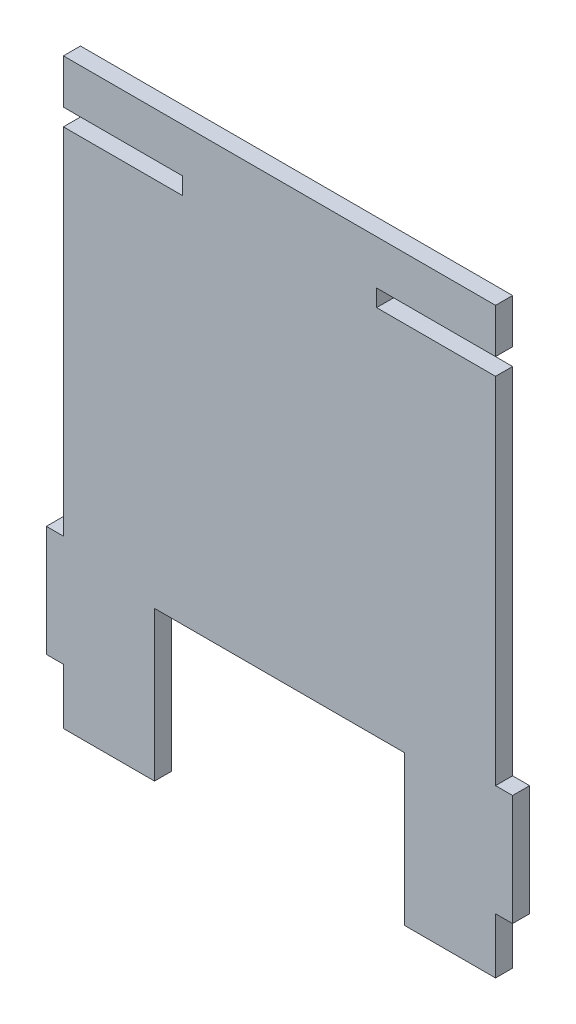
ISO-10303-21;
HEADER;
FILE_DESCRIPTION(('STEP AP214'),'2;1');
FILE_NAME('part.step','',(''),(''),'','','');
FILE_SCHEMA(('AUTOMOTIVE_DESIGN { 1 0 10303 214 1 1 1 1 }'));
ENDSEC;
DATA;
#1=APPLICATION_CONTEXT('core data for automotive mechanical design processes');
#2=APPLICATION_PROTOCOL_DEFINITION('international standard','automotive_design',2000,#1);
#3=PRODUCT_CONTEXT('',#1,'mechanical');
#4=PRODUCT('Part','Part','',(#3));
#5=PRODUCT_RELATED_PRODUCT_CATEGORY('part','',(#4));
#6=PRODUCT_DEFINITION_FORMATION('','',#4);
#7=PRODUCT_DEFINITION_CONTEXT('part definition',#1,'design');
#8=PRODUCT_DEFINITION('design','',#6,#7);
#9=PRODUCT_DEFINITION_SHAPE('','',#8);
#10=(LENGTH_UNIT() NAMED_UNIT(*) SI_UNIT(.MILLI.,.METRE.));
#11=(NAMED_UNIT(*) PLANE_ANGLE_UNIT() SI_UNIT($,.RADIAN.));
#12=(NAMED_UNIT(*) SI_UNIT($,.STERADIAN.) SOLID_ANGLE_UNIT());
#13=UNCERTAINTY_MEASURE_WITH_UNIT(LENGTH_MEASURE(1.E-05),#10,'distance_accuracy_value','');
#14=(GEOMETRIC_REPRESENTATION_CONTEXT(3) GLOBAL_UNCERTAINTY_ASSIGNED_CONTEXT((#13)) GLOBAL_UNIT_ASSIGNED_CONTEXT((#10,
#11,#12)) REPRESENTATION_CONTEXT('',''));
#15=CARTESIAN_POINT('',(0.,0.,0.));
#16=DIRECTION('',(0.,0.,1.));
#17=DIRECTION('',(1.,0.,0.));
#18=AXIS2_PLACEMENT_3D('',#15,#16,#17);
#19=CARTESIAN_POINT('',(-38.9099999999999,-383.79,19.98));
#20=DIRECTION('',(0.,1.,0.));
#21=DIRECTION('',(0.,0.,1.));
#22=AXIS2_PLACEMENT_3D('',#19,#20,#21);
#23=PLANE('',#22);
#24=DIRECTION('',(1.,0.,0.));
#25=VECTOR('',#24,1.);
#26=CARTESIAN_POINT('',(-38.9099999999999,-383.79,16.91));
#27=LINE('',#26,#25);
#28=CARTESIAN_POINT('',(-38.9099999999999,-383.79,16.91));
#29=VERTEX_POINT('',#28);
#30=CARTESIAN_POINT('',(-22.4999999999999,-383.79,16.91));
#31=VERTEX_POINT('',#30);
#32=EDGE_CURVE('E244',#29,#31,#27,.T.);
#33=ORIENTED_EDGE('',*,*,#32,.T.);
#34=DIRECTION('',(0.,0.,1.));
#35=VECTOR('',#34,1.);
#36=CARTESIAN_POINT('',(-22.4999999999999,-383.79,19.98));
#37=LINE('',#36,#35);
#38=CARTESIAN_POINT('',(-22.4999999999999,-383.79,19.98));
#39=VERTEX_POINT('',#38);
#40=EDGE_CURVE('E229',#31,#39,#37,.T.);
#41=ORIENTED_EDGE('',*,*,#40,.T.);
#42=DIRECTION('',(1.,0.,0.));
#43=VECTOR('',#42,1.);
#44=CARTESIAN_POINT('',(-38.9099999999999,-383.79,19.98));
#45=LINE('',#44,#43);
#46=CARTESIAN_POINT('',(-38.9099999999999,-383.79,19.98));
#47=VERTEX_POINT('',#46);
#48=EDGE_CURVE('E350',#47,#39,#45,.T.);
#49=ORIENTED_EDGE('',*,*,#48,.F.);
#50=DIRECTION('',(0.,0.,-1.));
#51=VECTOR('',#50,1.);
#52=CARTESIAN_POINT('',(-38.9099999999999,-383.79,19.98));
#53=LINE('',#52,#51);
#54=EDGE_CURVE('E295',#47,#29,#53,.T.);
#55=ORIENTED_EDGE('',*,*,#54,.T.);
#56=EDGE_LOOP('',(#33,#41,#49,#55));
#57=FACE_BOUND('',#56,.T.);
#58=ADVANCED_FACE('F43',(#57),#23,.F.);
#59=CARTESIAN_POINT('',(-17.49,-286.88,19.98));
#60=DIRECTION('',(0.,1.,0.));
#61=DIRECTION('',(0.,0.,1.));
#62=AXIS2_PLACEMENT_3D('',#59,#60,#61);
#63=PLANE('',#62);
#64=DIRECTION('',(1.,0.,0.));
#65=VECTOR('',#64,1.);
#66=CARTESIAN_POINT('',(-17.49,-286.88,16.91));
#67=LINE('',#66,#65);
#68=CARTESIAN_POINT('',(-38.9099999999999,-286.88,16.91));
#69=VERTEX_POINT('',#68);
#70=CARTESIAN_POINT('',(-17.49,-286.88,16.91));
#71=VERTEX_POINT('',#70);
#72=EDGE_CURVE('E225',#69,#71,#67,.T.);
#73=ORIENTED_EDGE('',*,*,#72,.T.);
#74=DIRECTION('',(0.,0.,-1.));
#75=VECTOR('',#74,1.);
#76=CARTESIAN_POINT('',(-17.49,-286.88,19.98));
#77=LINE('',#76,#75);
#78=CARTESIAN_POINT('',(-17.49,-286.88,19.98));
#79=VERTEX_POINT('',#78);
#80=EDGE_CURVE('E51',#79,#71,#77,.T.);
#81=ORIENTED_EDGE('',*,*,#80,.F.);
#82=DIRECTION('',(1.,0.,0.));
#83=VECTOR('',#82,1.);
#84=CARTESIAN_POINT('',(-17.49,-286.88,19.98));
#85=LINE('',#84,#83);
#86=CARTESIAN_POINT('',(-38.9099999999999,-286.88,19.98));
#87=VERTEX_POINT('',#86);
#88=EDGE_CURVE('E267',#87,#79,#85,.T.);
#89=ORIENTED_EDGE('',*,*,#88,.F.);
#90=DIRECTION('',(0.,0.,-1.));
#91=VECTOR('',#90,1.);
#92=CARTESIAN_POINT('',(-38.9099999999999,-286.88,19.98));
#93=LINE('',#92,#91);
#94=EDGE_CURVE('E221',#87,#69,#93,.T.);
#95=ORIENTED_EDGE('',*,*,#94,.T.);
#96=EDGE_LOOP('',(#73,#81,#89,#95));
#97=FACE_BOUND('',#96,.T.);
#98=ADVANCED_FACE('F45',(#97),#63,.F.);
#99=CARTESIAN_POINT('',(-17.49,-286.88,19.98));
#100=DIRECTION('',(1.,0.,0.));
#101=DIRECTION('',(0.,0.,-1.));
#102=AXIS2_PLACEMENT_3D('',#99,#100,#101);
#103=PLANE('',#102);
#104=DIRECTION('',(0.,-1.,0.));
#105=VECTOR('',#104,1.);
#106=CARTESIAN_POINT('',(-17.49,-286.88,16.91));
#107=LINE('',#106,#105);
#108=CARTESIAN_POINT('',(-17.49,-289.95,16.91));
#109=VERTEX_POINT('',#108);
#110=EDGE_CURVE('E228',#71,#109,#107,.T.);
#111=ORIENTED_EDGE('',*,*,#110,.T.);
#112=DIRECTION('',(0.,0.,-1.));
#113=VECTOR('',#112,1.);
#114=CARTESIAN_POINT('',(-17.49,-289.95,19.98));
#115=LINE('',#114,#113);
#116=CARTESIAN_POINT('',(-17.49,-289.95,19.98));
#117=VERTEX_POINT('',#116);
#118=EDGE_CURVE('E313',#117,#109,#115,.T.);
#119=ORIENTED_EDGE('',*,*,#118,.F.);
#120=DIRECTION('',(0.,-1.,0.));
#121=VECTOR('',#120,1.);
#122=CARTESIAN_POINT('',(-17.49,-286.88,19.98));
#123=LINE('',#122,#121);
#124=EDGE_CURVE('E145',#79,#117,#123,.T.);
#125=ORIENTED_EDGE('',*,*,#124,.F.);
#126=ORIENTED_EDGE('',*,*,#80,.T.);
#127=EDGE_LOOP('',(#111,#119,#125,#126));
#128=FACE_BOUND('',#127,.T.);
#129=ADVANCED_FACE('F316',(#128),#103,.F.);
#130=CARTESIAN_POINT('',(-17.49,-289.95,19.98));
#131=DIRECTION('',(0.,-1.,0.));
#132=DIRECTION('',(0.,0.,-1.));
#133=AXIS2_PLACEMENT_3D('',#130,#131,#132);
#134=PLANE('',#133);
#135=DIRECTION('',(-1.,0.,0.));
#136=VECTOR('',#135,1.);
#137=CARTESIAN_POINT('',(-17.49,-289.95,16.91));
#138=LINE('',#137,#136);
#139=CARTESIAN_POINT('',(-38.9099999999999,-289.95,16.91));
#140=VERTEX_POINT('',#139);
#141=EDGE_CURVE('E231',#109,#140,#138,.T.);
#142=ORIENTED_EDGE('',*,*,#141,.T.);
#143=DIRECTION('',(0.,0.,-1.));
#144=VECTOR('',#143,1.);
#145=CARTESIAN_POINT('',(-38.9099999999999,-289.95,19.98));
#146=LINE('',#145,#144);
#147=CARTESIAN_POINT('',(-38.9099999999999,-289.95,19.98));
#148=VERTEX_POINT('',#147);
#149=EDGE_CURVE('E310',#148,#140,#146,.T.);
#150=ORIENTED_EDGE('',*,*,#149,.F.);
#151=DIRECTION('',(-1.,0.,0.));
#152=VECTOR('',#151,1.);
#153=CARTESIAN_POINT('',(-17.49,-289.95,19.98));
#154=LINE('',#153,#152);
#155=EDGE_CURVE('E337',#117,#148,#154,.T.);
#156=ORIENTED_EDGE('',*,*,#155,.F.);
#157=ORIENTED_EDGE('',*,*,#118,.T.);
#158=EDGE_LOOP('',(#142,#150,#156,#157));
#159=FACE_BOUND('',#158,.T.);
#160=ADVANCED_FACE('F328',(#159),#134,.F.);
#161=CARTESIAN_POINT('',(-38.9099999999999,-289.95,19.98));
#162=DIRECTION('',(1.,0.,0.));
#163=DIRECTION('',(0.,1.,0.));
#164=AXIS2_PLACEMENT_3D('',#161,#162,#163);
#165=PLANE('',#164);
#166=DIRECTION('',(0.,-1.,0.));
#167=VECTOR('',#166,1.);
#168=CARTESIAN_POINT('',(-38.9099999999999,-289.95,16.91));
#169=LINE('',#168,#167);
#170=CARTESIAN_POINT('',(-38.9099999999999,-353.79,16.91));
#171=VERTEX_POINT('',#170);
#172=EDGE_CURVE('E233',#140,#171,#169,.T.);
#173=ORIENTED_EDGE('',*,*,#172,.T.);
#174=DIRECTION('',(0.,0.,-1.));
#175=VECTOR('',#174,1.);
#176=CARTESIAN_POINT('',(-38.9099999999999,-353.79,19.98));
#177=LINE('',#176,#175);
#178=CARTESIAN_POINT('',(-38.9099999999999,-353.79,19.98));
#179=VERTEX_POINT('',#178);
#180=EDGE_CURVE('E307',#179,#171,#177,.T.);
#181=ORIENTED_EDGE('',*,*,#180,.F.);
#182=DIRECTION('',(0.,-1.,0.));
#183=VECTOR('',#182,1.);
#184=CARTESIAN_POINT('',(-38.9099999999999,-289.95,19.98));
#185=LINE('',#184,#183);
#186=EDGE_CURVE('E334',#148,#179,#185,.T.);
#187=ORIENTED_EDGE('',*,*,#186,.F.);
#188=ORIENTED_EDGE('',*,*,#149,.T.);
#189=EDGE_LOOP('',(#173,#181,#187,#188));
#190=FACE_BOUND('',#189,.T.);
#191=ADVANCED_FACE('F332',(#190),#165,.F.);
#192=CARTESIAN_POINT('',(-38.9099999999999,-353.79,19.98));
#193=DIRECTION('',(0.,-1.,0.));
#194=DIRECTION('',(0.,0.,-1.));
#195=AXIS2_PLACEMENT_3D('',#192,#193,#194);
#196=PLANE('',#195);
#197=DIRECTION('',(-1.,0.,0.));
#198=VECTOR('',#197,1.);
#199=CARTESIAN_POINT('',(-38.9099999999999,-353.79,16.91));
#200=LINE('',#199,#198);
#201=CARTESIAN_POINT('',(-41.9799999999999,-353.79,16.91));
#202=VERTEX_POINT('',#201);
#203=EDGE_CURVE('E235',#171,#202,#200,.T.);
#204=ORIENTED_EDGE('',*,*,#203,.T.);
#205=DIRECTION('',(0.,0.,-1.));
#206=VECTOR('',#205,1.);
#207=CARTESIAN_POINT('',(-41.9799999999999,-353.79,19.98));
#208=LINE('',#207,#206);
#209=CARTESIAN_POINT('',(-41.9799999999999,-353.79,19.98));
#210=VERTEX_POINT('',#209);
#211=EDGE_CURVE('E304',#210,#202,#208,.T.);
#212=ORIENTED_EDGE('',*,*,#211,.F.);
#213=DIRECTION('',(-1.,0.,0.));
#214=VECTOR('',#213,1.);
#215=CARTESIAN_POINT('',(-38.9099999999999,-353.79,19.98));
#216=LINE('',#215,#214);
#217=EDGE_CURVE('E336',#179,#210,#216,.T.);
#218=ORIENTED_EDGE('',*,*,#217,.F.);
#219=ORIENTED_EDGE('',*,*,#180,.T.);
#220=EDGE_LOOP('',(#204,#212,#218,#219));
#221=FACE_BOUND('',#220,.T.);
#222=ADVANCED_FACE('F439',(#221),#196,.F.);
#223=CARTESIAN_POINT('',(-41.9799999999999,-353.79,19.98));
#224=DIRECTION('',(1.,0.,0.));
#225=DIRECTION('',(0.,0.,-1.));
#226=AXIS2_PLACEMENT_3D('',#223,#224,#225);
#227=PLANE('',#226);
#228=DIRECTION('',(0.,-1.,0.));
#229=VECTOR('',#228,1.);
#230=CARTESIAN_POINT('',(-41.9799999999999,-353.79,16.91));
#231=LINE('',#230,#229);
#232=CARTESIAN_POINT('',(-41.9799999999999,-373.77,16.91));
#233=VERTEX_POINT('',#232);
#234=EDGE_CURVE('E237',#202,#233,#231,.T.);
#235=ORIENTED_EDGE('',*,*,#234,.T.);
#236=DIRECTION('',(0.,0.,-1.));
#237=VECTOR('',#236,1.);
#238=CARTESIAN_POINT('',(-41.9799999999999,-373.77,19.98));
#239=LINE('',#238,#237);
#240=CARTESIAN_POINT('',(-41.9799999999999,-373.77,19.98));
#241=VERTEX_POINT('',#240);
#242=EDGE_CURVE('E301',#241,#233,#239,.T.);
#243=ORIENTED_EDGE('',*,*,#242,.F.);
#244=DIRECTION('',(0.,-1.,0.));
#245=VECTOR('',#244,1.);
#246=CARTESIAN_POINT('',(-41.9799999999999,-353.79,19.98));
#247=LINE('',#246,#245);
#248=EDGE_CURVE('E339',#210,#241,#247,.T.);
#249=ORIENTED_EDGE('',*,*,#248,.F.);
#250=ORIENTED_EDGE('',*,*,#211,.T.);
#251=EDGE_LOOP('',(#235,#243,#249,#250));
#252=FACE_BOUND('',#251,.T.);
#253=ADVANCED_FACE('F436',(#252),#227,.F.);
#254=CARTESIAN_POINT('',(-41.9799999999999,-373.77,19.98));
#255=DIRECTION('',(0.,1.,0.));
#256=DIRECTION('',(0.,0.,1.));
#257=AXIS2_PLACEMENT_3D('',#254,#255,#256);
#258=PLANE('',#257);
#259=DIRECTION('',(1.,0.,0.));
#260=VECTOR('',#259,1.);
#261=CARTESIAN_POINT('',(-41.9799999999999,-373.77,16.91));
#262=LINE('',#261,#260);
#263=CARTESIAN_POINT('',(-38.9099999999999,-373.77,16.91));
#264=VERTEX_POINT('',#263);
#265=EDGE_CURVE('E239',#233,#264,#262,.T.);
#266=ORIENTED_EDGE('',*,*,#265,.T.);
#267=DIRECTION('',(0.,0.,-1.));
#268=VECTOR('',#267,1.);
#269=CARTESIAN_POINT('',(-38.9099999999999,-373.77,19.98));
#270=LINE('',#269,#268);
#271=CARTESIAN_POINT('',(-38.9099999999999,-373.77,19.98));
#272=VERTEX_POINT('',#271);
#273=EDGE_CURVE('E298',#272,#264,#270,.T.);
#274=ORIENTED_EDGE('',*,*,#273,.F.);
#275=DIRECTION('',(1.,0.,0.));
#276=VECTOR('',#275,1.);
#277=CARTESIAN_POINT('',(-41.9799999999999,-373.77,19.98));
#278=LINE('',#277,#276);
#279=EDGE_CURVE('E345',#241,#272,#278,.T.);
#280=ORIENTED_EDGE('',*,*,#279,.F.);
#281=ORIENTED_EDGE('',*,*,#242,.T.);
#282=EDGE_LOOP('',(#266,#274,#280,#281));
#283=FACE_BOUND('',#282,.T.);
#284=ADVANCED_FACE('F432',(#283),#258,.F.);
#285=CARTESIAN_POINT('',(-38.9099999999999,-373.77,19.98));
#286=DIRECTION('',(1.,0.,0.));
#287=DIRECTION('',(0.,0.,-1.));
#288=AXIS2_PLACEMENT_3D('',#285,#286,#287);
#289=PLANE('',#288);
#290=DIRECTION('',(0.,-1.,0.));
#291=VECTOR('',#290,1.);
#292=CARTESIAN_POINT('',(-38.9099999999999,-373.77,16.91));
#293=LINE('',#292,#291);
#294=EDGE_CURVE('E241',#264,#29,#293,.T.);
#295=ORIENTED_EDGE('',*,*,#294,.T.);
#296=ORIENTED_EDGE('',*,*,#54,.F.);
#297=DIRECTION('',(0.,-1.,0.));
#298=VECTOR('',#297,1.);
#299=CARTESIAN_POINT('',(-38.9099999999999,-373.77,19.98));
#300=LINE('',#299,#298);
#301=EDGE_CURVE('E347',#272,#47,#300,.T.);
#302=ORIENTED_EDGE('',*,*,#301,.F.);
#303=ORIENTED_EDGE('',*,*,#273,.T.);
#304=EDGE_LOOP('',(#295,#296,#302,#303));
#305=FACE_BOUND('',#304,.T.);
#306=ADVANCED_FACE('F427',(#305),#289,.F.);
#307=CARTESIAN_POINT('',(22.5,-383.79,19.98));
#308=VERTEX_POINT('',#307);
#309=CARTESIAN_POINT('',(38.91,-383.79,19.98));
#310=VERTEX_POINT('',#309);
#311=EDGE_CURVE('E349',#308,#310,#45,.T.);
#312=ORIENTED_EDGE('',*,*,#311,.F.);
#313=DIRECTION('',(0.,0.,-1.));
#314=VECTOR('',#313,1.);
#315=CARTESIAN_POINT('',(22.5,-383.79,19.98));
#316=LINE('',#315,#314);
#317=CARTESIAN_POINT('',(22.5,-383.79,16.91));
#318=VERTEX_POINT('',#317);
#319=EDGE_CURVE('E380',#308,#318,#316,.T.);
#320=ORIENTED_EDGE('',*,*,#319,.T.);
#321=CARTESIAN_POINT('',(38.91,-383.79,16.91));
#322=VERTEX_POINT('',#321);
#323=EDGE_CURVE('E243',#318,#322,#27,.T.);
#324=ORIENTED_EDGE('',*,*,#323,.T.);
#325=DIRECTION('',(0.,0.,-1.));
#326=VECTOR('',#325,1.);
#327=CARTESIAN_POINT('',(38.91,-383.79,19.98));
#328=LINE('',#327,#326);
#329=EDGE_CURVE('E292',#310,#322,#328,.T.);
#330=ORIENTED_EDGE('',*,*,#329,.F.);
#331=EDGE_LOOP('',(#312,#320,#324,#330));
#332=FACE_BOUND('',#331,.T.);
#333=ADVANCED_FACE('F451',(#332),#23,.F.);
#334=CARTESIAN_POINT('',(38.91,-373.77,19.98));
#335=DIRECTION('',(-1.,0.,0.));
#336=DIRECTION('',(0.,0.,1.));
#337=AXIS2_PLACEMENT_3D('',#334,#335,#336);
#338=PLANE('',#337);
#339=DIRECTION('',(0.,1.,0.));
#340=VECTOR('',#339,1.);
#341=CARTESIAN_POINT('',(38.91,-373.77,16.91));
#342=LINE('',#341,#340);
#343=CARTESIAN_POINT('',(38.91,-373.77,16.91));
#344=VERTEX_POINT('',#343);
#345=EDGE_CURVE('E247',#322,#344,#342,.T.);
#346=ORIENTED_EDGE('',*,*,#345,.T.);
#347=DIRECTION('',(0.,0.,-1.));
#348=VECTOR('',#347,1.);
#349=CARTESIAN_POINT('',(38.91,-373.77,19.98));
#350=LINE('',#349,#348);
#351=CARTESIAN_POINT('',(38.91,-373.77,19.98));
#352=VERTEX_POINT('',#351);
#353=EDGE_CURVE('E289',#352,#344,#350,.T.);
#354=ORIENTED_EDGE('',*,*,#353,.F.);
#355=DIRECTION('',(0.,1.,0.));
#356=VECTOR('',#355,1.);
#357=CARTESIAN_POINT('',(38.91,-373.77,19.98));
#358=LINE('',#357,#356);
#359=EDGE_CURVE('E352',#310,#352,#358,.T.);
#360=ORIENTED_EDGE('',*,*,#359,.F.);
#361=ORIENTED_EDGE('',*,*,#329,.T.);
#362=EDGE_LOOP('',(#346,#354,#360,#361));
#363=FACE_BOUND('',#362,.T.);
#364=ADVANCED_FACE('F459',(#363),#338,.F.);
#365=CARTESIAN_POINT('',(41.9799999999999,-373.77,19.98));
#366=DIRECTION('',(0.,1.,0.));
#367=DIRECTION('',(0.,0.,1.));
#368=AXIS2_PLACEMENT_3D('',#365,#366,#367);
#369=PLANE('',#368);
#370=DIRECTION('',(1.,0.,0.));
#371=VECTOR('',#370,1.);
#372=CARTESIAN_POINT('',(41.9799999999999,-373.77,16.91));
#373=LINE('',#372,#371);
#374=CARTESIAN_POINT('',(41.9799999999999,-373.77,16.91));
#375=VERTEX_POINT('',#374);
#376=EDGE_CURVE('E249',#344,#375,#373,.T.);
#377=ORIENTED_EDGE('',*,*,#376,.T.);
#378=DIRECTION('',(0.,0.,-1.));
#379=VECTOR('',#378,1.);
#380=CARTESIAN_POINT('',(41.9799999999999,-373.77,19.98));
#381=LINE('',#380,#379);
#382=CARTESIAN_POINT('',(41.9799999999999,-373.77,19.98));
#383=VERTEX_POINT('',#382);
#384=EDGE_CURVE('E286',#383,#375,#381,.T.);
#385=ORIENTED_EDGE('',*,*,#384,.F.);
#386=DIRECTION('',(1.,0.,0.));
#387=VECTOR('',#386,1.);
#388=CARTESIAN_POINT('',(41.9799999999999,-373.77,19.98));
#389=LINE('',#388,#387);
#390=EDGE_CURVE('E354',#352,#383,#389,.T.);
#391=ORIENTED_EDGE('',*,*,#390,.F.);
#392=ORIENTED_EDGE('',*,*,#353,.T.);
#393=EDGE_LOOP('',(#377,#385,#391,#392));
#394=FACE_BOUND('',#393,.T.);
#395=ADVANCED_FACE('F466',(#394),#369,.F.);
#396=CARTESIAN_POINT('',(41.9799999999999,-353.79,19.98));
#397=DIRECTION('',(-1.,0.,0.));
#398=DIRECTION('',(0.,0.,1.));
#399=AXIS2_PLACEMENT_3D('',#396,#397,#398);
#400=PLANE('',#399);
#401=DIRECTION('',(0.,1.,0.));
#402=VECTOR('',#401,1.);
#403=CARTESIAN_POINT('',(41.9799999999999,-353.79,16.91));
#404=LINE('',#403,#402);
#405=CARTESIAN_POINT('',(41.9799999999999,-353.79,16.91));
#406=VERTEX_POINT('',#405);
#407=EDGE_CURVE('E251',#375,#406,#404,.T.);
#408=ORIENTED_EDGE('',*,*,#407,.T.);
#409=DIRECTION('',(0.,0.,-1.));
#410=VECTOR('',#409,1.);
#411=CARTESIAN_POINT('',(41.9799999999999,-353.79,19.98));
#412=LINE('',#411,#410);
#413=CARTESIAN_POINT('',(41.9799999999999,-353.79,19.98));
#414=VERTEX_POINT('',#413);
#415=EDGE_CURVE('E283',#414,#406,#412,.T.);
#416=ORIENTED_EDGE('',*,*,#415,.F.);
#417=DIRECTION('',(0.,1.,0.));
#418=VECTOR('',#417,1.);
#419=CARTESIAN_POINT('',(41.9799999999999,-353.79,19.98));
#420=LINE('',#419,#418);
#421=EDGE_CURVE('E356',#383,#414,#420,.T.);
#422=ORIENTED_EDGE('',*,*,#421,.F.);
#423=ORIENTED_EDGE('',*,*,#384,.T.);
#424=EDGE_LOOP('',(#408,#416,#422,#423));
#425=FACE_BOUND('',#424,.T.);
#426=ADVANCED_FACE('F510',(#425),#400,.F.);
#427=CARTESIAN_POINT('',(38.9099999999999,-353.79,19.98));
#428=DIRECTION('',(0.,-1.,0.));
#429=DIRECTION('',(0.,0.,-1.));
#430=AXIS2_PLACEMENT_3D('',#427,#428,#429);
#431=PLANE('',#430);
#432=DIRECTION('',(-1.,0.,0.));
#433=VECTOR('',#432,1.);
#434=CARTESIAN_POINT('',(38.9099999999999,-353.79,16.91));
#435=LINE('',#434,#433);
#436=CARTESIAN_POINT('',(38.9099999999999,-353.79,16.91));
#437=VERTEX_POINT('',#436);
#438=EDGE_CURVE('E253',#406,#437,#435,.T.);
#439=ORIENTED_EDGE('',*,*,#438,.T.);
#440=DIRECTION('',(0.,0.,-1.));
#441=VECTOR('',#440,1.);
#442=CARTESIAN_POINT('',(38.9099999999999,-353.79,19.98));
#443=LINE('',#442,#441);
#444=CARTESIAN_POINT('',(38.9099999999999,-353.79,19.98));
#445=VERTEX_POINT('',#444);
#446=EDGE_CURVE('E280',#445,#437,#443,.T.);
#447=ORIENTED_EDGE('',*,*,#446,.F.);
#448=DIRECTION('',(-1.,0.,0.));
#449=VECTOR('',#448,1.);
#450=CARTESIAN_POINT('',(38.9099999999999,-353.79,19.98));
#451=LINE('',#450,#449);
#452=EDGE_CURVE('E358',#414,#445,#451,.T.);
#453=ORIENTED_EDGE('',*,*,#452,.F.);
#454=ORIENTED_EDGE('',*,*,#415,.T.);
#455=EDGE_LOOP('',(#439,#447,#453,#454));
#456=FACE_BOUND('',#455,.T.);
#457=ADVANCED_FACE('F506',(#456),#431,.F.);
#458=CARTESIAN_POINT('',(38.9099999999999,-289.95,19.98));
#459=DIRECTION('',(-1.,0.,0.));
#460=DIRECTION('',(0.,-1.,0.));
#461=AXIS2_PLACEMENT_3D('',#458,#459,#460);
#462=PLANE('',#461);
#463=DIRECTION('',(0.,1.,0.));
#464=VECTOR('',#463,1.);
#465=CARTESIAN_POINT('',(38.9099999999999,-289.95,16.91));
#466=LINE('',#465,#464);
#467=CARTESIAN_POINT('',(38.9099999999999,-289.95,16.91));
#468=VERTEX_POINT('',#467);
#469=EDGE_CURVE('E255',#437,#468,#466,.T.);
#470=ORIENTED_EDGE('',*,*,#469,.T.);
#471=DIRECTION('',(0.,0.,-1.));
#472=VECTOR('',#471,1.);
#473=CARTESIAN_POINT('',(38.9099999999999,-289.95,19.98));
#474=LINE('',#473,#472);
#475=CARTESIAN_POINT('',(38.9099999999999,-289.95,19.98));
#476=VERTEX_POINT('',#475);
#477=EDGE_CURVE('E277',#476,#468,#474,.T.);
#478=ORIENTED_EDGE('',*,*,#477,.F.);
#479=DIRECTION('',(0.,1.,0.));
#480=VECTOR('',#479,1.);
#481=CARTESIAN_POINT('',(38.9099999999999,-289.95,19.98));
#482=LINE('',#481,#480);
#483=EDGE_CURVE('E360',#445,#476,#482,.T.);
#484=ORIENTED_EDGE('',*,*,#483,.F.);
#485=ORIENTED_EDGE('',*,*,#446,.T.);
#486=EDGE_LOOP('',(#470,#478,#484,#485));
#487=FACE_BOUND('',#486,.T.);
#488=ADVANCED_FACE('F502',(#487),#462,.F.);
#489=CARTESIAN_POINT('',(17.49,-289.95,19.98));
#490=DIRECTION('',(0.,-1.,0.));
#491=DIRECTION('',(0.,0.,-1.));
#492=AXIS2_PLACEMENT_3D('',#489,#490,#491);
#493=PLANE('',#492);
#494=DIRECTION('',(-1.,0.,0.));
#495=VECTOR('',#494,1.);
#496=CARTESIAN_POINT('',(17.49,-289.95,16.91));
#497=LINE('',#496,#495);
#498=CARTESIAN_POINT('',(17.49,-289.95,16.91));
#499=VERTEX_POINT('',#498);
#500=EDGE_CURVE('E257',#468,#499,#497,.T.);
#501=ORIENTED_EDGE('',*,*,#500,.T.);
#502=DIRECTION('',(0.,0.,-1.));
#503=VECTOR('',#502,1.);
#504=CARTESIAN_POINT('',(17.49,-289.95,19.98));
#505=LINE('',#504,#503);
#506=CARTESIAN_POINT('',(17.49,-289.95,19.98));
#507=VERTEX_POINT('',#506);
#508=EDGE_CURVE('E274',#507,#499,#505,.T.);
#509=ORIENTED_EDGE('',*,*,#508,.F.);
#510=DIRECTION('',(-1.,0.,0.));
#511=VECTOR('',#510,1.);
#512=CARTESIAN_POINT('',(17.49,-289.95,19.98));
#513=LINE('',#512,#511);
#514=EDGE_CURVE('E362',#476,#507,#513,.T.);
#515=ORIENTED_EDGE('',*,*,#514,.F.);
#516=ORIENTED_EDGE('',*,*,#477,.T.);
#517=EDGE_LOOP('',(#501,#509,#515,#516));
#518=FACE_BOUND('',#517,.T.);
#519=ADVANCED_FACE('F499',(#518),#493,.F.);
#520=CARTESIAN_POINT('',(17.49,-286.88,19.98));
#521=DIRECTION('',(-1.,0.,0.));
#522=DIRECTION('',(0.,0.,1.));
#523=AXIS2_PLACEMENT_3D('',#520,#521,#522);
#524=PLANE('',#523);
#525=DIRECTION('',(0.,1.,0.));
#526=VECTOR('',#525,1.);
#527=CARTESIAN_POINT('',(17.49,-286.88,16.91));
#528=LINE('',#527,#526);
#529=CARTESIAN_POINT('',(17.49,-286.88,16.91));
#530=VERTEX_POINT('',#529);
#531=EDGE_CURVE('E259',#499,#530,#528,.T.);
#532=ORIENTED_EDGE('',*,*,#531,.T.);
#533=DIRECTION('',(0.,0.,-1.));
#534=VECTOR('',#533,1.);
#535=CARTESIAN_POINT('',(17.49,-286.88,19.98));
#536=LINE('',#535,#534);
#537=CARTESIAN_POINT('',(17.49,-286.88,19.98));
#538=VERTEX_POINT('',#537);
#539=EDGE_CURVE('E271',#538,#530,#536,.T.);
#540=ORIENTED_EDGE('',*,*,#539,.F.);
#541=DIRECTION('',(0.,1.,0.));
#542=VECTOR('',#541,1.);
#543=CARTESIAN_POINT('',(17.49,-286.88,19.98));
#544=LINE('',#543,#542);
#545=EDGE_CURVE('E364',#507,#538,#544,.T.);
#546=ORIENTED_EDGE('',*,*,#545,.F.);
#547=ORIENTED_EDGE('',*,*,#508,.T.);
#548=EDGE_LOOP('',(#532,#540,#546,#547));
#549=FACE_BOUND('',#548,.T.);
#550=ADVANCED_FACE('F370',(#549),#524,.F.);
#551=CARTESIAN_POINT('',(17.49,-286.88,19.98));
#552=DIRECTION('',(0.,1.,0.));
#553=DIRECTION('',(0.,0.,1.));
#554=AXIS2_PLACEMENT_3D('',#551,#552,#553);
#555=PLANE('',#554);
#556=DIRECTION('',(1.,0.,0.));
#557=VECTOR('',#556,1.);
#558=CARTESIAN_POINT('',(17.49,-286.88,16.91));
#559=LINE('',#558,#557);
#560=CARTESIAN_POINT('',(38.9099999999999,-286.88,16.91));
#561=VERTEX_POINT('',#560);
#562=EDGE_CURVE('E261',#530,#561,#559,.T.);
#563=ORIENTED_EDGE('',*,*,#562,.T.);
#564=DIRECTION('',(0.,0.,-1.));
#565=VECTOR('',#564,1.);
#566=CARTESIAN_POINT('',(38.9099999999999,-286.88,19.98));
#567=LINE('',#566,#565);
#568=CARTESIAN_POINT('',(38.9099999999999,-286.88,19.98));
#569=VERTEX_POINT('',#568);
#570=EDGE_CURVE('E216',#569,#561,#567,.T.);
#571=ORIENTED_EDGE('',*,*,#570,.F.);
#572=DIRECTION('',(1.,0.,0.));
#573=VECTOR('',#572,1.);
#574=CARTESIAN_POINT('',(17.49,-286.88,19.98));
#575=LINE('',#574,#573);
#576=EDGE_CURVE('E204',#538,#569,#575,.T.);
#577=ORIENTED_EDGE('',*,*,#576,.F.);
#578=ORIENTED_EDGE('',*,*,#539,.T.);
#579=EDGE_LOOP('',(#563,#571,#577,#578));
#580=FACE_BOUND('',#579,.T.);
#581=ADVANCED_FACE('F374',(#580),#555,.F.);
#582=CARTESIAN_POINT('',(38.9099999999999,-286.88,19.98));
#583=DIRECTION('',(-1.,0.,0.));
#584=DIRECTION('',(0.,0.,1.));
#585=AXIS2_PLACEMENT_3D('',#582,#583,#584);
#586=PLANE('',#585);
#587=DIRECTION('',(0.,1.,0.));
#588=VECTOR('',#587,1.);
#589=CARTESIAN_POINT('',(38.9099999999999,-286.88,16.91));
#590=LINE('',#589,#588);
#591=CARTESIAN_POINT('',(38.9099999999999,-278.88,16.91));
#592=VERTEX_POINT('',#591);
#593=EDGE_CURVE('E213',#561,#592,#590,.T.);
#594=ORIENTED_EDGE('',*,*,#593,.T.);
#595=DIRECTION('',(0.,0.,-1.));
#596=VECTOR('',#595,1.);
#597=CARTESIAN_POINT('',(38.9099999999999,-278.88,19.98));
#598=LINE('',#597,#596);
#599=CARTESIAN_POINT('',(38.9099999999999,-278.88,19.98));
#600=VERTEX_POINT('',#599);
#601=EDGE_CURVE('E210',#600,#592,#598,.T.);
#602=ORIENTED_EDGE('',*,*,#601,.F.);
#603=DIRECTION('',(0.,1.,0.));
#604=VECTOR('',#603,1.);
#605=CARTESIAN_POINT('',(38.9099999999999,-286.88,19.98));
#606=LINE('',#605,#604);
#607=EDGE_CURVE('E196',#569,#600,#606,.T.);
#608=ORIENTED_EDGE('',*,*,#607,.F.);
#609=ORIENTED_EDGE('',*,*,#570,.T.);
#610=EDGE_LOOP('',(#594,#602,#608,#609));
#611=FACE_BOUND('',#610,.T.);
#612=ADVANCED_FACE('F211',(#611),#586,.F.);
#613=CARTESIAN_POINT('',(-38.9099999999999,-278.88,19.98));
#614=DIRECTION('',(0.,-1.,0.));
#615=DIRECTION('',(0.,0.,-1.));
#616=AXIS2_PLACEMENT_3D('',#613,#614,#615);
#617=PLANE('',#616);
#618=DIRECTION('',(-1.,0.,0.));
#619=VECTOR('',#618,1.);
#620=CARTESIAN_POINT('',(-38.9099999999999,-278.88,16.91));
#621=LINE('',#620,#619);
#622=CARTESIAN_POINT('',(-38.9099999999999,-278.88,16.91));
#623=VERTEX_POINT('',#622);
#624=EDGE_CURVE('E264',#592,#623,#621,.T.);
#625=ORIENTED_EDGE('',*,*,#624,.T.);
#626=DIRECTION('',(0.,0.,-1.));
#627=VECTOR('',#626,1.);
#628=CARTESIAN_POINT('',(-38.9099999999999,-278.88,19.98));
#629=LINE('',#628,#627);
#630=CARTESIAN_POINT('',(-38.9099999999999,-278.88,19.98));
#631=VERTEX_POINT('',#630);
#632=EDGE_CURVE('E217',#631,#623,#629,.T.);
#633=ORIENTED_EDGE('',*,*,#632,.F.);
#634=DIRECTION('',(-1.,0.,0.));
#635=VECTOR('',#634,1.);
#636=CARTESIAN_POINT('',(-38.9099999999999,-278.88,19.98));
#637=LINE('',#636,#635);
#638=EDGE_CURVE('E201',#600,#631,#637,.T.);
#639=ORIENTED_EDGE('',*,*,#638,.F.);
#640=ORIENTED_EDGE('',*,*,#601,.T.);
#641=EDGE_LOOP('',(#625,#633,#639,#640));
#642=FACE_BOUND('',#641,.T.);
#643=ADVANCED_FACE('F219',(#642),#617,.F.);
#644=CARTESIAN_POINT('',(-38.9099999999999,-286.88,19.98));
#645=DIRECTION('',(1.,0.,0.));
#646=DIRECTION('',(0.,0.,-1.));
#647=AXIS2_PLACEMENT_3D('',#644,#645,#646);
#648=PLANE('',#647);
#649=DIRECTION('',(0.,-1.,0.));
#650=VECTOR('',#649,1.);
#651=CARTESIAN_POINT('',(-38.9099999999999,-286.88,16.91));
#652=LINE('',#651,#650);
#653=EDGE_CURVE('E136',#623,#69,#652,.T.);
#654=ORIENTED_EDGE('',*,*,#653,.T.);
#655=ORIENTED_EDGE('',*,*,#94,.F.);
#656=DIRECTION('',(0.,-1.,0.));
#657=VECTOR('',#656,1.);
#658=CARTESIAN_POINT('',(-38.9099999999999,-286.88,19.98));
#659=LINE('',#658,#657);
#660=EDGE_CURVE('E67',#631,#87,#659,.T.);
#661=ORIENTED_EDGE('',*,*,#660,.F.);
#662=ORIENTED_EDGE('',*,*,#632,.T.);
#663=EDGE_LOOP('',(#654,#655,#661,#662));
#664=FACE_BOUND('',#663,.T.);
#665=ADVANCED_FACE('F375',(#664),#648,.F.);
#666=CARTESIAN_POINT('',(0.,0.,19.98));
#667=DIRECTION('',(0.,0.,-1.));
#668=DIRECTION('',(-1.,0.,0.));
#669=AXIS2_PLACEMENT_3D('',#666,#667,#668);
#670=PLANE('',#669);
#671=ORIENTED_EDGE('',*,*,#48,.T.);
#672=DIRECTION('',(0.,-1.,0.));
#673=VECTOR('',#672,1.);
#674=CARTESIAN_POINT('',(-22.4999999999999,-386.85,19.98));
#675=LINE('',#674,#673);
#676=CARTESIAN_POINT('',(-22.5,-356.85,19.98));
#677=VERTEX_POINT('',#676);
#678=EDGE_CURVE('E389',#677,#39,#675,.T.);
#679=ORIENTED_EDGE('',*,*,#678,.F.);
#680=DIRECTION('',(-1.,0.,0.));
#681=VECTOR('',#680,1.);
#682=CARTESIAN_POINT('',(-22.5,-356.85,19.98));
#683=LINE('',#682,#681);
#684=CARTESIAN_POINT('',(22.5,-356.85,19.98));
#685=VERTEX_POINT('',#684);
#686=EDGE_CURVE('E392',#685,#677,#683,.T.);
#687=ORIENTED_EDGE('',*,*,#686,.F.);
#688=DIRECTION('',(0.,1.,0.));
#689=VECTOR('',#688,1.);
#690=CARTESIAN_POINT('',(22.5,-386.85,19.98));
#691=LINE('',#690,#689);
#692=EDGE_CURVE('E395',#308,#685,#691,.T.);
#693=ORIENTED_EDGE('',*,*,#692,.F.);
#694=ORIENTED_EDGE('',*,*,#311,.T.);
#695=ORIENTED_EDGE('',*,*,#359,.T.);
#696=ORIENTED_EDGE('',*,*,#390,.T.);
#697=ORIENTED_EDGE('',*,*,#421,.T.);
#698=ORIENTED_EDGE('',*,*,#452,.T.);
#699=ORIENTED_EDGE('',*,*,#483,.T.);
#700=ORIENTED_EDGE('',*,*,#514,.T.);
#701=ORIENTED_EDGE('',*,*,#545,.T.);
#702=ORIENTED_EDGE('',*,*,#576,.T.);
#703=ORIENTED_EDGE('',*,*,#607,.T.);
#704=ORIENTED_EDGE('',*,*,#638,.T.);
#705=ORIENTED_EDGE('',*,*,#660,.T.);
#706=ORIENTED_EDGE('',*,*,#88,.T.);
#707=ORIENTED_EDGE('',*,*,#124,.T.);
#708=ORIENTED_EDGE('',*,*,#155,.T.);
#709=ORIENTED_EDGE('',*,*,#186,.T.);
#710=ORIENTED_EDGE('',*,*,#217,.T.);
#711=ORIENTED_EDGE('',*,*,#248,.T.);
#712=ORIENTED_EDGE('',*,*,#279,.T.);
#713=ORIENTED_EDGE('',*,*,#301,.T.);
#714=EDGE_LOOP('',(#671,#679,#687,#693,#694,#695,#696,#697,#698,#699,#700,#701,#702,#703,#704,
#705,#706,#707,#708,#709,#710,#711,#712,#713));
#715=FACE_BOUND('',#714,.T.);
#716=ADVANCED_FACE('F199',(#715),#670,.F.);
#717=CARTESIAN_POINT('',(0.,0.,16.91));
#718=DIRECTION('',(0.,0.,-1.));
#719=DIRECTION('',(-1.,0.,0.));
#720=AXIS2_PLACEMENT_3D('',#717,#718,#719);
#721=PLANE('',#720);
#722=DIRECTION('',(0.,-1.,0.));
#723=VECTOR('',#722,1.);
#724=CARTESIAN_POINT('',(-22.4999999999999,-386.85,16.91));
#725=LINE('',#724,#723);
#726=CARTESIAN_POINT('',(-22.5,-356.85,16.91));
#727=VERTEX_POINT('',#726);
#728=EDGE_CURVE('E386',#727,#31,#725,.T.);
#729=ORIENTED_EDGE('',*,*,#728,.T.);
#730=ORIENTED_EDGE('',*,*,#32,.F.);
#731=ORIENTED_EDGE('',*,*,#294,.F.);
#732=ORIENTED_EDGE('',*,*,#265,.F.);
#733=ORIENTED_EDGE('',*,*,#234,.F.);
#734=ORIENTED_EDGE('',*,*,#203,.F.);
#735=ORIENTED_EDGE('',*,*,#172,.F.);
#736=ORIENTED_EDGE('',*,*,#141,.F.);
#737=ORIENTED_EDGE('',*,*,#110,.F.);
#738=ORIENTED_EDGE('',*,*,#72,.F.);
#739=ORIENTED_EDGE('',*,*,#653,.F.);
#740=ORIENTED_EDGE('',*,*,#624,.F.);
#741=ORIENTED_EDGE('',*,*,#593,.F.);
#742=ORIENTED_EDGE('',*,*,#562,.F.);
#743=ORIENTED_EDGE('',*,*,#531,.F.);
#744=ORIENTED_EDGE('',*,*,#500,.F.);
#745=ORIENTED_EDGE('',*,*,#469,.F.);
#746=ORIENTED_EDGE('',*,*,#438,.F.);
#747=ORIENTED_EDGE('',*,*,#407,.F.);
#748=ORIENTED_EDGE('',*,*,#376,.F.);
#749=ORIENTED_EDGE('',*,*,#345,.F.);
#750=ORIENTED_EDGE('',*,*,#323,.F.);
#751=DIRECTION('',(0.,-1.,0.));
#752=VECTOR('',#751,1.);
#753=CARTESIAN_POINT('',(22.5,0.,16.91));
#754=LINE('',#753,#752);
#755=CARTESIAN_POINT('',(22.5,-356.85,16.91));
#756=VERTEX_POINT('',#755);
#757=EDGE_CURVE('E11',#756,#318,#754,.T.);
#758=ORIENTED_EDGE('',*,*,#757,.F.);
#759=DIRECTION('',(-1.,0.,0.));
#760=VECTOR('',#759,1.);
#761=CARTESIAN_POINT('',(-22.5,-356.85,16.91));
#762=LINE('',#761,#760);
#763=EDGE_CURVE('E58',#756,#727,#762,.T.);
#764=ORIENTED_EDGE('',*,*,#763,.T.);
#765=EDGE_LOOP('',(#729,#730,#731,#732,#733,#734,#735,#736,#737,#738,#739,#740,#741,#742,#743,
#744,#745,#746,#747,#748,#749,#750,#758,#764));
#766=FACE_BOUND('',#765,.T.);
#767=ADVANCED_FACE('F322',(#766),#721,.T.);
#768=CARTESIAN_POINT('',(-22.4999999999999,-386.85,16.91));
#769=DIRECTION('',(-1.,0.,0.));
#770=DIRECTION('',(0.,-1.,0.));
#771=AXIS2_PLACEMENT_3D('',#768,#769,#770);
#772=PLANE('',#771);
#773=ORIENTED_EDGE('',*,*,#728,.F.);
#774=DIRECTION('',(0.,0.,1.));
#775=VECTOR('',#774,1.);
#776=CARTESIAN_POINT('',(-22.5,-356.85,16.91));
#777=LINE('',#776,#775);
#778=EDGE_CURVE('E383',#727,#677,#777,.T.);
#779=ORIENTED_EDGE('',*,*,#778,.T.);
#780=ORIENTED_EDGE('',*,*,#678,.T.);
#781=ORIENTED_EDGE('',*,*,#40,.F.);
#782=EDGE_LOOP('',(#773,#779,#780,#781));
#783=FACE_BOUND('',#782,.T.);
#784=ADVANCED_FACE('F418',(#783),#772,.F.);
#785=CARTESIAN_POINT('',(22.5,-386.85,16.91));
#786=DIRECTION('',(1.,0.,0.));
#787=DIRECTION('',(0.,1.,0.));
#788=AXIS2_PLACEMENT_3D('',#785,#786,#787);
#789=PLANE('',#788);
#790=ORIENTED_EDGE('',*,*,#692,.T.);
#791=DIRECTION('',(0.,0.,1.));
#792=VECTOR('',#791,1.);
#793=CARTESIAN_POINT('',(22.5,-356.85,16.91));
#794=LINE('',#793,#792);
#795=EDGE_CURVE('E384',#756,#685,#794,.T.);
#796=ORIENTED_EDGE('',*,*,#795,.F.);
#797=ORIENTED_EDGE('',*,*,#757,.T.);
#798=ORIENTED_EDGE('',*,*,#319,.F.);
#799=EDGE_LOOP('',(#790,#796,#797,#798));
#800=FACE_BOUND('',#799,.T.);
#801=ADVANCED_FACE('F474',(#800),#789,.F.);
#802=CARTESIAN_POINT('',(-22.5,-356.85,16.91));
#803=DIRECTION('',(0.,1.,0.));
#804=DIRECTION('',(0.,0.,1.));
#805=AXIS2_PLACEMENT_3D('',#802,#803,#804);
#806=PLANE('',#805);
#807=ORIENTED_EDGE('',*,*,#686,.T.);
#808=ORIENTED_EDGE('',*,*,#778,.F.);
#809=ORIENTED_EDGE('',*,*,#763,.F.);
#810=ORIENTED_EDGE('',*,*,#795,.T.);
#811=EDGE_LOOP('',(#807,#808,#809,#810));
#812=FACE_BOUND('',#811,.T.);
#813=ADVANCED_FACE('F475',(#812),#806,.F.);
#814=CLOSED_SHELL('',(#58,#98,#129,#160,#191,#222,#253,#284,#306,#333,#364,#395,#426,#457,#488,
#519,#550,#581,#612,#643,#665,#716,#767,#784,#801,#813));
#815=MANIFOLD_SOLID_BREP('B2',#814);
#816=ADVANCED_BREP_SHAPE_REPRESENTATION('',(#18,#815),#14);
#817=SHAPE_DEFINITION_REPRESENTATION(#9,#816);
ENDSEC;
END-ISO-10303-21;
